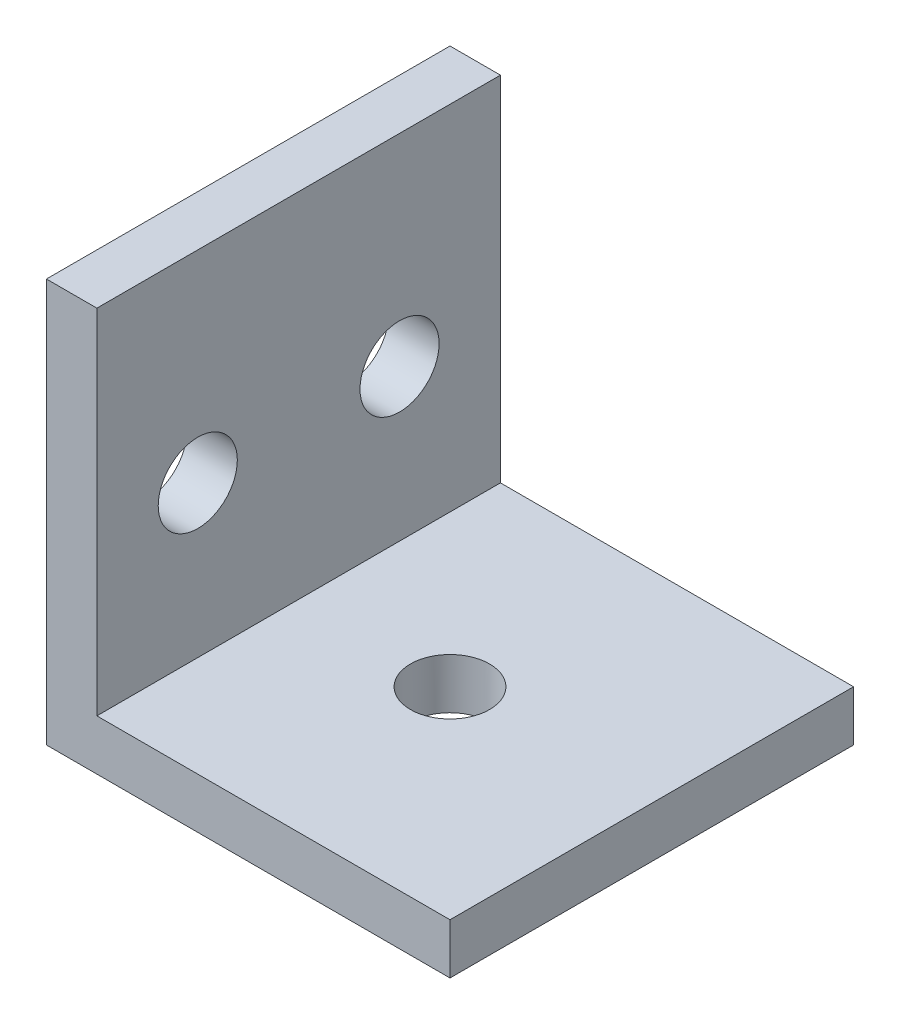
ISO-10303-21;
HEADER;
FILE_DESCRIPTION(('STEP AP214'),'2;1');
FILE_NAME('part.step','',(''),(''),'','','');
FILE_SCHEMA(('AUTOMOTIVE_DESIGN { 1 0 10303 214 1 1 1 1 }'));
ENDSEC;
DATA;
#1=APPLICATION_CONTEXT('core data for automotive mechanical design processes');
#2=APPLICATION_PROTOCOL_DEFINITION('international standard','automotive_design',2000,#1);
#3=PRODUCT_CONTEXT('',#1,'mechanical');
#4=PRODUCT('Part','Part','',(#3));
#5=PRODUCT_RELATED_PRODUCT_CATEGORY('part','',(#4));
#6=PRODUCT_DEFINITION_FORMATION('','',#4);
#7=PRODUCT_DEFINITION_CONTEXT('part definition',#1,'design');
#8=PRODUCT_DEFINITION('design','',#6,#7);
#9=PRODUCT_DEFINITION_SHAPE('','',#8);
#10=(LENGTH_UNIT() NAMED_UNIT(*) SI_UNIT(.MILLI.,.METRE.));
#11=(NAMED_UNIT(*) PLANE_ANGLE_UNIT() SI_UNIT($,.RADIAN.));
#12=(NAMED_UNIT(*) SI_UNIT($,.STERADIAN.) SOLID_ANGLE_UNIT());
#13=UNCERTAINTY_MEASURE_WITH_UNIT(LENGTH_MEASURE(1.E-05),#10,'distance_accuracy_value','');
#14=(GEOMETRIC_REPRESENTATION_CONTEXT(3) GLOBAL_UNCERTAINTY_ASSIGNED_CONTEXT((#13)) GLOBAL_UNIT_ASSIGNED_CONTEXT((#10,
#11,#12)) REPRESENTATION_CONTEXT('',''));
#15=CARTESIAN_POINT('',(0.,0.,0.));
#16=DIRECTION('',(0.,0.,1.));
#17=DIRECTION('',(1.,0.,0.));
#18=AXIS2_PLACEMENT_3D('',#15,#16,#17);
#19=CARTESIAN_POINT('',(25.4,0.,12.7));
#20=DIRECTION('',(0.,1.,0.));
#21=DIRECTION('',(-1.,0.,0.));
#22=AXIS2_PLACEMENT_3D('',#19,#20,#21);
#23=PLANE('',#22);
#24=CARTESIAN_POINT('',(12.7,0.,0.));
#25=DIRECTION('',(0.,1.,0.));
#26=DIRECTION('',(0.,0.,1.));
#27=AXIS2_PLACEMENT_3D('',#24,#25,#26);
#28=CIRCLE('',#27,2.4892);
#29=CARTESIAN_POINT('',(12.7,0.,2.4892));
#30=VERTEX_POINT('',#29);
#31=EDGE_CURVE('E194',#30,#30,#28,.T.);
#32=ORIENTED_EDGE('',*,*,#31,.T.);
#33=EDGE_LOOP('',(#32));
#34=FACE_BOUND('',#33,.T.);
#35=DIRECTION('',(1.,0.,0.));
#36=VECTOR('',#35,1.);
#37=CARTESIAN_POINT('',(25.4,0.,-12.7));
#38=LINE('',#37,#36);
#39=CARTESIAN_POINT('',(0.,0.,-12.7));
#40=VERTEX_POINT('',#39);
#41=CARTESIAN_POINT('',(25.4,0.,-12.7));
#42=VERTEX_POINT('',#41);
#43=EDGE_CURVE('E135',#40,#42,#38,.T.);
#44=ORIENTED_EDGE('',*,*,#43,.T.);
#45=DIRECTION('',(0.,0.,-1.));
#46=VECTOR('',#45,1.);
#47=CARTESIAN_POINT('',(25.4,0.,12.7));
#48=LINE('',#47,#46);
#49=CARTESIAN_POINT('',(25.4,0.,12.7));
#50=VERTEX_POINT('',#49);
#51=EDGE_CURVE('E11',#50,#42,#48,.T.);
#52=ORIENTED_EDGE('',*,*,#51,.F.);
#53=DIRECTION('',(1.,0.,0.));
#54=VECTOR('',#53,1.);
#55=CARTESIAN_POINT('',(25.4,0.,12.7));
#56=LINE('',#55,#54);
#57=CARTESIAN_POINT('',(0.,0.,12.7));
#58=VERTEX_POINT('',#57);
#59=EDGE_CURVE('E151',#58,#50,#56,.T.);
#60=ORIENTED_EDGE('',*,*,#59,.F.);
#61=DIRECTION('',(0.,0.,-1.));
#62=VECTOR('',#61,1.);
#63=CARTESIAN_POINT('',(0.,0.,12.7));
#64=LINE('',#63,#62);
#65=EDGE_CURVE('E131',#58,#40,#64,.T.);
#66=ORIENTED_EDGE('',*,*,#65,.T.);
#67=EDGE_LOOP('',(#44,#52,#60,#66));
#68=FACE_BOUND('',#67,.T.);
#69=ADVANCED_FACE('F45',(#34,#68),#23,.F.);
#70=CARTESIAN_POINT('',(25.4,3.175,12.7));
#71=DIRECTION('',(-1.,0.,0.));
#72=DIRECTION('',(0.,0.,1.));
#73=AXIS2_PLACEMENT_3D('',#70,#71,#72);
#74=PLANE('',#73);
#75=DIRECTION('',(0.,1.,0.));
#76=VECTOR('',#75,1.);
#77=CARTESIAN_POINT('',(25.4,3.175,-12.7));
#78=LINE('',#77,#76);
#79=CARTESIAN_POINT('',(25.4,3.175,-12.7));
#80=VERTEX_POINT('',#79);
#81=EDGE_CURVE('E139',#42,#80,#78,.T.);
#82=ORIENTED_EDGE('',*,*,#81,.T.);
#83=DIRECTION('',(0.,0.,-1.));
#84=VECTOR('',#83,1.);
#85=CARTESIAN_POINT('',(25.4,3.175,12.7));
#86=LINE('',#85,#84);
#87=CARTESIAN_POINT('',(25.4,3.175,12.7));
#88=VERTEX_POINT('',#87);
#89=EDGE_CURVE('E55',#88,#80,#86,.T.);
#90=ORIENTED_EDGE('',*,*,#89,.F.);
#91=DIRECTION('',(0.,1.,0.));
#92=VECTOR('',#91,1.);
#93=CARTESIAN_POINT('',(25.4,3.175,12.7));
#94=LINE('',#93,#92);
#95=EDGE_CURVE('E100',#50,#88,#94,.T.);
#96=ORIENTED_EDGE('',*,*,#95,.F.);
#97=ORIENTED_EDGE('',*,*,#51,.T.);
#98=EDGE_LOOP('',(#82,#90,#96,#97));
#99=FACE_BOUND('',#98,.T.);
#100=ADVANCED_FACE('F185',(#99),#74,.F.);
#101=CARTESIAN_POINT('',(3.175,3.175,12.7));
#102=DIRECTION('',(0.,-1.,0.));
#103=DIRECTION('',(0.,0.,-1.));
#104=AXIS2_PLACEMENT_3D('',#101,#102,#103);
#105=PLANE('',#104);
#106=CARTESIAN_POINT('',(12.7,3.175,0.));
#107=DIRECTION('',(0.,-1.,0.));
#108=DIRECTION('',(0.,0.,-1.));
#109=AXIS2_PLACEMENT_3D('',#106,#107,#108);
#110=CIRCLE('',#109,2.4892);
#111=CARTESIAN_POINT('',(12.7,3.175,-2.4892));
#112=VERTEX_POINT('',#111);
#113=EDGE_CURVE('E48',#112,#112,#110,.T.);
#114=ORIENTED_EDGE('',*,*,#113,.T.);
#115=EDGE_LOOP('',(#114));
#116=FACE_BOUND('',#115,.T.);
#117=DIRECTION('',(-1.,0.,0.));
#118=VECTOR('',#117,1.);
#119=CARTESIAN_POINT('',(3.175,3.175,-12.7));
#120=LINE('',#119,#118);
#121=CARTESIAN_POINT('',(3.175,3.175,-12.7));
#122=VERTEX_POINT('',#121);
#123=EDGE_CURVE('E142',#80,#122,#120,.T.);
#124=ORIENTED_EDGE('',*,*,#123,.T.);
#125=DIRECTION('',(0.,0.,-1.));
#126=VECTOR('',#125,1.);
#127=CARTESIAN_POINT('',(3.175,3.175,12.7));
#128=LINE('',#127,#126);
#129=CARTESIAN_POINT('',(3.175,3.175,12.7));
#130=VERTEX_POINT('',#129);
#131=EDGE_CURVE('E124',#130,#122,#128,.T.);
#132=ORIENTED_EDGE('',*,*,#131,.F.);
#133=DIRECTION('',(-1.,0.,0.));
#134=VECTOR('',#133,1.);
#135=CARTESIAN_POINT('',(3.175,3.175,12.7));
#136=LINE('',#135,#134);
#137=EDGE_CURVE('E113',#88,#130,#136,.T.);
#138=ORIENTED_EDGE('',*,*,#137,.F.);
#139=ORIENTED_EDGE('',*,*,#89,.T.);
#140=EDGE_LOOP('',(#124,#132,#138,#139));
#141=FACE_BOUND('',#140,.T.);
#142=ADVANCED_FACE('F162',(#116,#141),#105,.F.);
#143=CARTESIAN_POINT('',(3.175,25.4,12.7));
#144=DIRECTION('',(-1.,0.,0.));
#145=DIRECTION('',(0.,-1.,0.));
#146=AXIS2_PLACEMENT_3D('',#143,#144,#145);
#147=PLANE('',#146);
#148=CARTESIAN_POINT('',(3.175,12.7,6.35));
#149=DIRECTION('',(-1.,0.,0.));
#150=DIRECTION('',(0.,-1.,0.));
#151=AXIS2_PLACEMENT_3D('',#148,#149,#150);
#152=CIRCLE('',#151,2.4892);
#153=CARTESIAN_POINT('',(3.175,10.2108,6.35));
#154=VERTEX_POINT('',#153);
#155=EDGE_CURVE('E197',#154,#154,#152,.T.);
#156=ORIENTED_EDGE('',*,*,#155,.T.);
#157=EDGE_LOOP('',(#156));
#158=FACE_BOUND('',#157,.T.);
#159=CARTESIAN_POINT('',(3.175,12.7,-6.35));
#160=DIRECTION('',(-1.,0.,0.));
#161=DIRECTION('',(0.,-1.,0.));
#162=AXIS2_PLACEMENT_3D('',#159,#160,#161);
#163=CIRCLE('',#162,2.4892);
#164=CARTESIAN_POINT('',(3.175,10.2108,-6.35));
#165=VERTEX_POINT('',#164);
#166=EDGE_CURVE('E203',#165,#165,#163,.T.);
#167=ORIENTED_EDGE('',*,*,#166,.T.);
#168=EDGE_LOOP('',(#167));
#169=FACE_BOUND('',#168,.T.);
#170=DIRECTION('',(0.,1.,0.));
#171=VECTOR('',#170,1.);
#172=CARTESIAN_POINT('',(3.175,25.4,-12.7));
#173=LINE('',#172,#171);
#174=CARTESIAN_POINT('',(3.175,25.4,-12.7));
#175=VERTEX_POINT('',#174);
#176=EDGE_CURVE('E122',#122,#175,#173,.T.);
#177=ORIENTED_EDGE('',*,*,#176,.T.);
#178=DIRECTION('',(0.,0.,-1.));
#179=VECTOR('',#178,1.);
#180=CARTESIAN_POINT('',(3.175,25.4,12.7));
#181=LINE('',#180,#179);
#182=CARTESIAN_POINT('',(3.175,25.4,12.7));
#183=VERTEX_POINT('',#182);
#184=EDGE_CURVE('E119',#183,#175,#181,.T.);
#185=ORIENTED_EDGE('',*,*,#184,.F.);
#186=DIRECTION('',(0.,1.,0.));
#187=VECTOR('',#186,1.);
#188=CARTESIAN_POINT('',(3.175,25.4,12.7));
#189=LINE('',#188,#187);
#190=EDGE_CURVE('E107',#130,#183,#189,.T.);
#191=ORIENTED_EDGE('',*,*,#190,.F.);
#192=ORIENTED_EDGE('',*,*,#131,.T.);
#193=EDGE_LOOP('',(#177,#185,#191,#192));
#194=FACE_BOUND('',#193,.T.);
#195=ADVANCED_FACE('F120',(#158,#169,#194),#147,.F.);
#196=CARTESIAN_POINT('',(0.,25.4,12.7));
#197=DIRECTION('',(0.,-1.,0.));
#198=DIRECTION('',(0.,0.,-1.));
#199=AXIS2_PLACEMENT_3D('',#196,#197,#198);
#200=PLANE('',#199);
#201=DIRECTION('',(-1.,0.,0.));
#202=VECTOR('',#201,1.);
#203=CARTESIAN_POINT('',(0.,25.4,-12.7));
#204=LINE('',#203,#202);
#205=CARTESIAN_POINT('',(0.,25.4,-12.7));
#206=VERTEX_POINT('',#205);
#207=EDGE_CURVE('E86',#175,#206,#204,.T.);
#208=ORIENTED_EDGE('',*,*,#207,.T.);
#209=DIRECTION('',(0.,0.,-1.));
#210=VECTOR('',#209,1.);
#211=CARTESIAN_POINT('',(0.,25.4,12.7));
#212=LINE('',#211,#210);
#213=CARTESIAN_POINT('',(0.,25.4,12.7));
#214=VERTEX_POINT('',#213);
#215=EDGE_CURVE('E125',#214,#206,#212,.T.);
#216=ORIENTED_EDGE('',*,*,#215,.F.);
#217=DIRECTION('',(-1.,0.,0.));
#218=VECTOR('',#217,1.);
#219=CARTESIAN_POINT('',(0.,25.4,12.7));
#220=LINE('',#219,#218);
#221=EDGE_CURVE('E111',#183,#214,#220,.T.);
#222=ORIENTED_EDGE('',*,*,#221,.F.);
#223=ORIENTED_EDGE('',*,*,#184,.T.);
#224=EDGE_LOOP('',(#208,#216,#222,#223));
#225=FACE_BOUND('',#224,.T.);
#226=ADVANCED_FACE('F127',(#225),#200,.F.);
#227=CARTESIAN_POINT('',(0.,0.,12.7));
#228=DIRECTION('',(1.,0.,0.));
#229=DIRECTION('',(0.,0.,-1.));
#230=AXIS2_PLACEMENT_3D('',#227,#228,#229);
#231=PLANE('',#230);
#232=CARTESIAN_POINT('',(0.,12.7,6.35));
#233=DIRECTION('',(1.,0.,0.));
#234=DIRECTION('',(0.,1.,0.));
#235=AXIS2_PLACEMENT_3D('',#232,#233,#234);
#236=CIRCLE('',#235,2.4892);
#237=CARTESIAN_POINT('',(0.,15.1892,6.35));
#238=VERTEX_POINT('',#237);
#239=EDGE_CURVE('E214',#238,#238,#236,.T.);
#240=ORIENTED_EDGE('',*,*,#239,.T.);
#241=EDGE_LOOP('',(#240));
#242=FACE_BOUND('',#241,.T.);
#243=CARTESIAN_POINT('',(0.,12.7,-6.35));
#244=DIRECTION('',(1.,0.,0.));
#245=DIRECTION('',(0.,1.,0.));
#246=AXIS2_PLACEMENT_3D('',#243,#244,#245);
#247=CIRCLE('',#246,2.4892);
#248=CARTESIAN_POINT('',(0.,15.1892,-6.35));
#249=VERTEX_POINT('',#248);
#250=EDGE_CURVE('E215',#249,#249,#247,.T.);
#251=ORIENTED_EDGE('',*,*,#250,.T.);
#252=EDGE_LOOP('',(#251));
#253=FACE_BOUND('',#252,.T.);
#254=DIRECTION('',(0.,-1.,0.));
#255=VECTOR('',#254,1.);
#256=CARTESIAN_POINT('',(0.,0.,-12.7));
#257=LINE('',#256,#255);
#258=EDGE_CURVE('E92',#206,#40,#257,.T.);
#259=ORIENTED_EDGE('',*,*,#258,.T.);
#260=ORIENTED_EDGE('',*,*,#65,.F.);
#261=DIRECTION('',(0.,-1.,0.));
#262=VECTOR('',#261,1.);
#263=CARTESIAN_POINT('',(0.,0.,12.7));
#264=LINE('',#263,#262);
#265=EDGE_CURVE('E63',#214,#58,#264,.T.);
#266=ORIENTED_EDGE('',*,*,#265,.F.);
#267=ORIENTED_EDGE('',*,*,#215,.T.);
#268=EDGE_LOOP('',(#259,#260,#266,#267));
#269=FACE_BOUND('',#268,.T.);
#270=ADVANCED_FACE('F169',(#242,#253,#269),#231,.F.);
#271=CARTESIAN_POINT('',(0.,0.,12.7));
#272=DIRECTION('',(0.,0.,-1.));
#273=DIRECTION('',(-1.,0.,0.));
#274=AXIS2_PLACEMENT_3D('',#271,#272,#273);
#275=PLANE('',#274);
#276=ORIENTED_EDGE('',*,*,#59,.T.);
#277=ORIENTED_EDGE('',*,*,#95,.T.);
#278=ORIENTED_EDGE('',*,*,#137,.T.);
#279=ORIENTED_EDGE('',*,*,#190,.T.);
#280=ORIENTED_EDGE('',*,*,#221,.T.);
#281=ORIENTED_EDGE('',*,*,#265,.T.);
#282=EDGE_LOOP('',(#276,#277,#278,#279,#280,#281));
#283=FACE_BOUND('',#282,.T.);
#284=ADVANCED_FACE('F109',(#283),#275,.F.);
#285=CARTESIAN_POINT('',(0.,0.,-12.7));
#286=DIRECTION('',(0.,0.,-1.));
#287=DIRECTION('',(-1.,0.,0.));
#288=AXIS2_PLACEMENT_3D('',#285,#286,#287);
#289=PLANE('',#288);
#290=ORIENTED_EDGE('',*,*,#43,.F.);
#291=ORIENTED_EDGE('',*,*,#258,.F.);
#292=ORIENTED_EDGE('',*,*,#207,.F.);
#293=ORIENTED_EDGE('',*,*,#176,.F.);
#294=ORIENTED_EDGE('',*,*,#123,.F.);
#295=ORIENTED_EDGE('',*,*,#81,.F.);
#296=EDGE_LOOP('',(#290,#291,#292,#293,#294,#295));
#297=FACE_BOUND('',#296,.T.);
#298=ADVANCED_FACE('F165',(#297),#289,.T.);
#299=CARTESIAN_POINT('',(12.7,0.,0.));
#300=DIRECTION('',(0.,1.,0.));
#301=DIRECTION('',(0.,0.,1.));
#302=AXIS2_PLACEMENT_3D('',#299,#300,#301);
#303=CYLINDRICAL_SURFACE('',#302,2.4892);
#304=ORIENTED_EDGE('',*,*,#31,.F.);
#305=EDGE_LOOP('',(#304));
#306=FACE_BOUND('',#305,.T.);
#307=ORIENTED_EDGE('',*,*,#113,.F.);
#308=EDGE_LOOP('',(#307));
#309=FACE_BOUND('',#308,.T.);
#310=ADVANCED_FACE('F233',(#306,#309),#303,.F.);
#311=CARTESIAN_POINT('',(0.,12.7,-6.35));
#312=DIRECTION('',(1.,0.,0.));
#313=DIRECTION('',(0.,1.,0.));
#314=AXIS2_PLACEMENT_3D('',#311,#312,#313);
#315=CYLINDRICAL_SURFACE('',#314,2.4892);
#316=ORIENTED_EDGE('',*,*,#250,.F.);
#317=EDGE_LOOP('',(#316));
#318=FACE_BOUND('',#317,.T.);
#319=ORIENTED_EDGE('',*,*,#166,.F.);
#320=EDGE_LOOP('',(#319));
#321=FACE_BOUND('',#320,.T.);
#322=ADVANCED_FACE('F225',(#318,#321),#315,.F.);
#323=CARTESIAN_POINT('',(0.,12.7,6.35));
#324=DIRECTION('',(1.,0.,0.));
#325=DIRECTION('',(0.,1.,0.));
#326=AXIS2_PLACEMENT_3D('',#323,#324,#325);
#327=CYLINDRICAL_SURFACE('',#326,2.4892);
#328=ORIENTED_EDGE('',*,*,#239,.F.);
#329=EDGE_LOOP('',(#328));
#330=FACE_BOUND('',#329,.T.);
#331=ORIENTED_EDGE('',*,*,#155,.F.);
#332=EDGE_LOOP('',(#331));
#333=FACE_BOUND('',#332,.T.);
#334=ADVANCED_FACE('F222',(#330,#333),#327,.F.);
#335=CLOSED_SHELL('',(#69,#100,#142,#195,#226,#270,#284,#298,#310,#322,#334));
#336=MANIFOLD_SOLID_BREP('B2',#335);
#337=ADVANCED_BREP_SHAPE_REPRESENTATION('',(#18,#336),#14);
#338=SHAPE_DEFINITION_REPRESENTATION(#9,#337);
ENDSEC;
END-ISO-10303-21;
